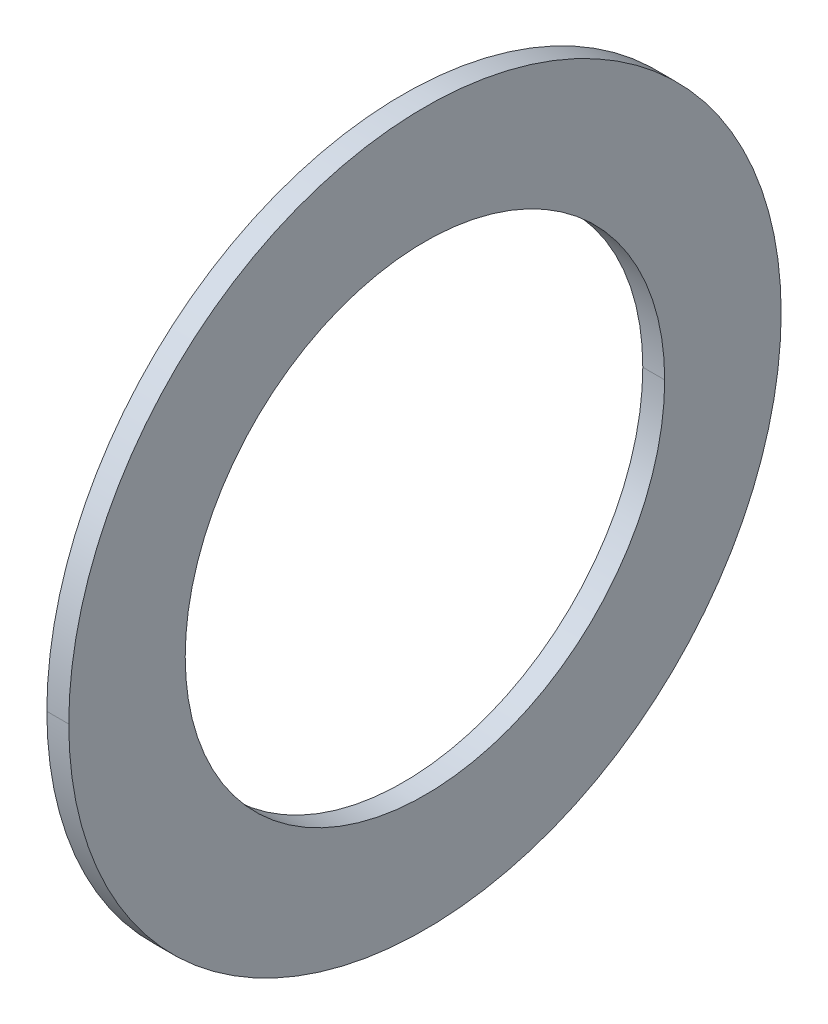
ISO-10303-21;
HEADER;
FILE_DESCRIPTION(('STEP AP214'),'2;1');
FILE_NAME('part.step','',(''),(''),'','','');
FILE_SCHEMA(('AUTOMOTIVE_DESIGN { 1 0 10303 214 1 1 1 1 }'));
ENDSEC;
DATA;
#1=APPLICATION_CONTEXT('core data for automotive mechanical design processes');
#2=APPLICATION_PROTOCOL_DEFINITION('international standard','automotive_design',2000,#1);
#3=PRODUCT_CONTEXT('',#1,'mechanical');
#4=PRODUCT('Part','Part','',(#3));
#5=PRODUCT_RELATED_PRODUCT_CATEGORY('part','',(#4));
#6=PRODUCT_DEFINITION_FORMATION('','',#4);
#7=PRODUCT_DEFINITION_CONTEXT('part definition',#1,'design');
#8=PRODUCT_DEFINITION('design','',#6,#7);
#9=PRODUCT_DEFINITION_SHAPE('','',#8);
#10=(LENGTH_UNIT() NAMED_UNIT(*) SI_UNIT(.MILLI.,.METRE.));
#11=(NAMED_UNIT(*) PLANE_ANGLE_UNIT() SI_UNIT($,.RADIAN.));
#12=(NAMED_UNIT(*) SI_UNIT($,.STERADIAN.) SOLID_ANGLE_UNIT());
#13=UNCERTAINTY_MEASURE_WITH_UNIT(LENGTH_MEASURE(1.E-05),#10,'distance_accuracy_value','');
#14=(GEOMETRIC_REPRESENTATION_CONTEXT(3) GLOBAL_UNCERTAINTY_ASSIGNED_CONTEXT((#13)) GLOBAL_UNIT_ASSIGNED_CONTEXT((#10,
#11,#12)) REPRESENTATION_CONTEXT('',''));
#15=CARTESIAN_POINT('',(0.,0.,0.));
#16=DIRECTION('',(0.,0.,1.));
#17=DIRECTION('',(1.,0.,0.));
#18=AXIS2_PLACEMENT_3D('',#15,#16,#17);
#19=CARTESIAN_POINT('',(0.8,0.,0.));
#20=DIRECTION('',(-1.,0.,0.));
#21=DIRECTION('',(0.,1.,0.));
#22=AXIS2_PLACEMENT_3D('',#19,#20,#21);
#23=CYLINDRICAL_SURFACE('',#22,17.5);
#24=DIRECTION('',(-1.,0.,0.));
#25=VECTOR('',#24,1.);
#26=CARTESIAN_POINT('',(0.8,0.,-17.5));
#27=LINE('',#26,#25);
#28=CARTESIAN_POINT('',(0.8,0.,-17.5));
#29=VERTEX_POINT('',#28);
#30=CARTESIAN_POINT('',(-0.8,0.,-17.5));
#31=VERTEX_POINT('',#30);
#32=EDGE_CURVE('E11',#29,#31,#27,.T.);
#33=ORIENTED_EDGE('',*,*,#32,.T.);
#34=CARTESIAN_POINT('',(-0.8,0.,0.));
#35=DIRECTION('',(1.,0.,0.));
#36=DIRECTION('',(0.,0.,-1.));
#37=AXIS2_PLACEMENT_3D('',#34,#35,#36);
#38=CIRCLE('',#37,17.5);
#39=CARTESIAN_POINT('',(-0.8,0.,17.5));
#40=VERTEX_POINT('',#39);
#41=EDGE_CURVE('E25',#40,#31,#38,.T.);
#42=ORIENTED_EDGE('',*,*,#41,.F.);
#43=DIRECTION('',(-1.,0.,0.));
#44=VECTOR('',#43,1.);
#45=CARTESIAN_POINT('',(0.8,0.,17.5));
#46=LINE('',#45,#44);
#47=CARTESIAN_POINT('',(0.8,0.,17.5));
#48=VERTEX_POINT('',#47);
#49=EDGE_CURVE('E94',#48,#40,#46,.T.);
#50=ORIENTED_EDGE('',*,*,#49,.F.);
#51=CARTESIAN_POINT('',(0.8,0.,0.));
#52=DIRECTION('',(1.,0.,0.));
#53=DIRECTION('',(0.,0.,-1.));
#54=AXIS2_PLACEMENT_3D('',#51,#52,#53);
#55=CIRCLE('',#54,17.5);
#56=EDGE_CURVE('E90',#48,#29,#55,.T.);
#57=ORIENTED_EDGE('',*,*,#56,.T.);
#58=EDGE_LOOP('',(#33,#42,#50,#57));
#59=FACE_BOUND('',#58,.T.);
#60=ADVANCED_FACE('F17',(#59),#23,.F.);
#61=CARTESIAN_POINT('',(0.8,0.,0.));
#62=DIRECTION('',(1.,0.,0.));
#63=DIRECTION('',(0.,0.,-1.));
#64=AXIS2_PLACEMENT_3D('',#61,#62,#63);
#65=PLANE('',#64);
#66=ORIENTED_EDGE('',*,*,#56,.F.);
#67=CARTESIAN_POINT('',(0.8,0.,0.));
#68=DIRECTION('',(1.,0.,0.));
#69=DIRECTION('',(0.,0.,-1.));
#70=AXIS2_PLACEMENT_3D('',#67,#68,#69);
#71=CIRCLE('',#70,17.5);
#72=EDGE_CURVE('E85',#29,#48,#71,.T.);
#73=ORIENTED_EDGE('',*,*,#72,.F.);
#74=EDGE_LOOP('',(#66,#73));
#75=FACE_BOUND('',#74,.T.);
#76=CARTESIAN_POINT('',(0.8,0.,0.));
#77=DIRECTION('',(1.,0.,0.));
#78=DIRECTION('',(0.,0.,-1.));
#79=AXIS2_PLACEMENT_3D('',#76,#77,#78);
#80=CIRCLE('',#79,26.);
#81=CARTESIAN_POINT('',(0.8,0.,-26.));
#82=VERTEX_POINT('',#81);
#83=CARTESIAN_POINT('',(0.8,0.,26.));
#84=VERTEX_POINT('',#83);
#85=EDGE_CURVE('E72',#82,#84,#80,.T.);
#86=ORIENTED_EDGE('',*,*,#85,.T.);
#87=CARTESIAN_POINT('',(0.8,0.,0.));
#88=DIRECTION('',(1.,0.,0.));
#89=DIRECTION('',(0.,0.,-1.));
#90=AXIS2_PLACEMENT_3D('',#87,#88,#89);
#91=CIRCLE('',#90,26.);
#92=EDGE_CURVE('E73',#84,#82,#91,.T.);
#93=ORIENTED_EDGE('',*,*,#92,.T.);
#94=EDGE_LOOP('',(#86,#93));
#95=FACE_BOUND('',#94,.T.);
#96=ADVANCED_FACE('F116',(#75,#95),#65,.T.);
#97=CARTESIAN_POINT('',(0.8,0.,0.));
#98=DIRECTION('',(-1.,0.,0.));
#99=DIRECTION('',(0.,1.,0.));
#100=AXIS2_PLACEMENT_3D('',#97,#98,#99);
#101=CYLINDRICAL_SURFACE('',#100,26.);
#102=DIRECTION('',(-1.,0.,0.));
#103=VECTOR('',#102,1.);
#104=CARTESIAN_POINT('',(0.8,0.,-26.));
#105=LINE('',#104,#103);
#106=CARTESIAN_POINT('',(-0.8,0.,-26.));
#107=VERTEX_POINT('',#106);
#108=EDGE_CURVE('E59',#82,#107,#105,.T.);
#109=ORIENTED_EDGE('',*,*,#108,.F.);
#110=ORIENTED_EDGE('',*,*,#92,.F.);
#111=DIRECTION('',(-1.,0.,0.));
#112=VECTOR('',#111,1.);
#113=CARTESIAN_POINT('',(0.8,0.,26.));
#114=LINE('',#113,#112);
#115=CARTESIAN_POINT('',(-0.8,0.,26.));
#116=VERTEX_POINT('',#115);
#117=EDGE_CURVE('E61',#84,#116,#114,.T.);
#118=ORIENTED_EDGE('',*,*,#117,.T.);
#119=CARTESIAN_POINT('',(-0.8,0.,0.));
#120=DIRECTION('',(1.,0.,0.));
#121=DIRECTION('',(0.,0.,-1.));
#122=AXIS2_PLACEMENT_3D('',#119,#120,#121);
#123=CIRCLE('',#122,26.);
#124=EDGE_CURVE('E54',#116,#107,#123,.T.);
#125=ORIENTED_EDGE('',*,*,#124,.T.);
#126=EDGE_LOOP('',(#109,#110,#118,#125));
#127=FACE_BOUND('',#126,.T.);
#128=ADVANCED_FACE('F56',(#127),#101,.T.);
#129=CARTESIAN_POINT('',(-0.8,0.,0.));
#130=DIRECTION('',(1.,0.,0.));
#131=DIRECTION('',(0.,0.,-1.));
#132=AXIS2_PLACEMENT_3D('',#129,#130,#131);
#133=PLANE('',#132);
#134=CARTESIAN_POINT('',(-0.8,0.,0.));
#135=DIRECTION('',(1.,0.,0.));
#136=DIRECTION('',(0.,0.,-1.));
#137=AXIS2_PLACEMENT_3D('',#134,#135,#136);
#138=CIRCLE('',#137,17.5);
#139=EDGE_CURVE('E64',#31,#40,#138,.T.);
#140=ORIENTED_EDGE('',*,*,#139,.T.);
#141=ORIENTED_EDGE('',*,*,#41,.T.);
#142=EDGE_LOOP('',(#140,#141));
#143=FACE_BOUND('',#142,.T.);
#144=ORIENTED_EDGE('',*,*,#124,.F.);
#145=CARTESIAN_POINT('',(-0.8,0.,0.));
#146=DIRECTION('',(1.,0.,0.));
#147=DIRECTION('',(0.,0.,-1.));
#148=AXIS2_PLACEMENT_3D('',#145,#146,#147);
#149=CIRCLE('',#148,26.);
#150=EDGE_CURVE('E66',#107,#116,#149,.T.);
#151=ORIENTED_EDGE('',*,*,#150,.F.);
#152=EDGE_LOOP('',(#144,#151));
#153=FACE_BOUND('',#152,.T.);
#154=ADVANCED_FACE('F67',(#143,#153),#133,.F.);
#155=CARTESIAN_POINT('',(0.8,0.,0.));
#156=DIRECTION('',(-1.,0.,0.));
#157=DIRECTION('',(0.,-1.,0.));
#158=AXIS2_PLACEMENT_3D('',#155,#156,#157);
#159=CYLINDRICAL_SURFACE('',#158,26.);
#160=ORIENTED_EDGE('',*,*,#108,.T.);
#161=ORIENTED_EDGE('',*,*,#150,.T.);
#162=ORIENTED_EDGE('',*,*,#117,.F.);
#163=ORIENTED_EDGE('',*,*,#85,.F.);
#164=EDGE_LOOP('',(#160,#161,#162,#163));
#165=FACE_BOUND('',#164,.T.);
#166=ADVANCED_FACE('F71',(#165),#159,.T.);
#167=CARTESIAN_POINT('',(0.8,0.,0.));
#168=DIRECTION('',(-1.,0.,0.));
#169=DIRECTION('',(0.,-1.,0.));
#170=AXIS2_PLACEMENT_3D('',#167,#168,#169);
#171=CYLINDRICAL_SURFACE('',#170,17.5);
#172=ORIENTED_EDGE('',*,*,#32,.F.);
#173=ORIENTED_EDGE('',*,*,#72,.T.);
#174=ORIENTED_EDGE('',*,*,#49,.T.);
#175=ORIENTED_EDGE('',*,*,#139,.F.);
#176=EDGE_LOOP('',(#172,#173,#174,#175));
#177=FACE_BOUND('',#176,.T.);
#178=ADVANCED_FACE('F112',(#177),#171,.F.);
#179=CLOSED_SHELL('',(#60,#96,#128,#154,#166,#178));
#180=MANIFOLD_SOLID_BREP('B1',#179);
#181=ADVANCED_BREP_SHAPE_REPRESENTATION('',(#18,#180),#14);
#182=SHAPE_DEFINITION_REPRESENTATION(#9,#181);
ENDSEC;
END-ISO-10303-21;
